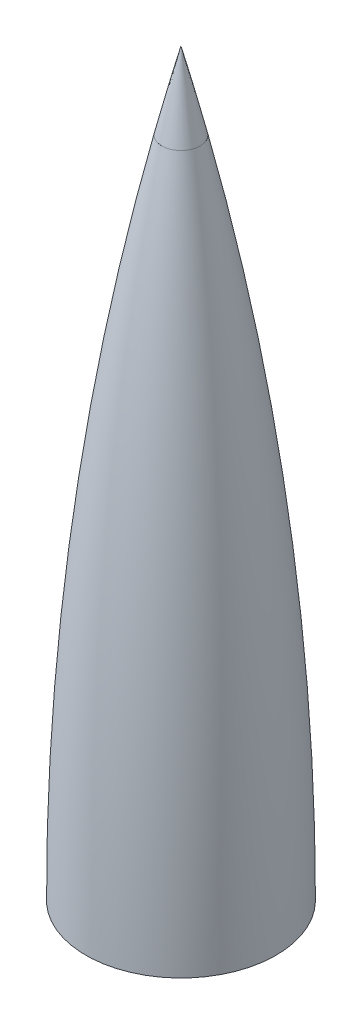
ISO-10303-21;
HEADER;
FILE_DESCRIPTION(('STEP AP214'),'2;1');
FILE_NAME('part.step','',(''),(''),'','','');
FILE_SCHEMA(('AUTOMOTIVE_DESIGN { 1 0 10303 214 1 1 1 1 }'));
ENDSEC;
DATA;
#1=APPLICATION_CONTEXT('core data for automotive mechanical design processes');
#2=APPLICATION_PROTOCOL_DEFINITION('international standard','automotive_design',2000,#1);
#3=PRODUCT_CONTEXT('',#1,'mechanical');
#4=PRODUCT('Part','Part','',(#3));
#5=PRODUCT_RELATED_PRODUCT_CATEGORY('part','',(#4));
#6=PRODUCT_DEFINITION_FORMATION('','',#4);
#7=PRODUCT_DEFINITION_CONTEXT('part definition',#1,'design');
#8=PRODUCT_DEFINITION('design','',#6,#7);
#9=PRODUCT_DEFINITION_SHAPE('','',#8);
#10=(LENGTH_UNIT() NAMED_UNIT(*) SI_UNIT(.MILLI.,.METRE.));
#11=(NAMED_UNIT(*) PLANE_ANGLE_UNIT() SI_UNIT($,.RADIAN.));
#12=(NAMED_UNIT(*) SI_UNIT($,.STERADIAN.) SOLID_ANGLE_UNIT());
#13=UNCERTAINTY_MEASURE_WITH_UNIT(LENGTH_MEASURE(1.E-05),#10,'distance_accuracy_value','');
#14=(GEOMETRIC_REPRESENTATION_CONTEXT(3) GLOBAL_UNCERTAINTY_ASSIGNED_CONTEXT((#13)) GLOBAL_UNIT_ASSIGNED_CONTEXT((#10,
#11,#12)) REPRESENTATION_CONTEXT('',''));
#15=CARTESIAN_POINT('',(0.,0.,0.));
#16=DIRECTION('',(0.,0.,1.));
#17=DIRECTION('',(1.,0.,0.));
#18=AXIS2_PLACEMENT_3D('',#15,#16,#17);
#19=CARTESIAN_POINT('',(0.,546.1,0.));
#20=DIRECTION('',(0.,1.,0.));
#21=DIRECTION('',(0.,0.,1.));
#22=AXIS2_PLACEMENT_3D('',#19,#20,#21);
#23=PLANE('',#22);
#24=CARTESIAN_POINT('',(0.,546.1,0.));
#25=DIRECTION('',(0.,1.,0.));
#26=DIRECTION('',(0.,0.,1.));
#27=AXIS2_PLACEMENT_3D('',#24,#25,#26);
#28=CIRCLE('',#27,15.6817968062124);
#29=CARTESIAN_POINT('',(0.,546.1,15.6817968062124));
#30=VERTEX_POINT('',#29);
#31=EDGE_CURVE('E12',#30,#30,#28,.T.);
#32=ORIENTED_EDGE('',*,*,#31,.F.);
#33=EDGE_LOOP('',(#32));
#34=FACE_BOUND('',#33,.T.);
#35=ADVANCED_FACE('F53',(#34),#23,.F.);
#36=CARTESIAN_POINT('',(0.,-0.00285855555803849,-2332.04763425161));
#37=DIRECTION('',(-1.,0.,0.));
#38=DIRECTION('',(0.,0.,1.));
#39=AXIS2_PLACEMENT_3D('',#36,#37,#38);
#40=CIRCLE('',#39,2410.40698090128);
#41=TRIMMED_CURVE('',#40,(PARAMETER_VALUE(-0.255681213942053)),
(PARAMETER_VALUE(0.255681213942053)),.T.,.PARAMETER.);
#42=CARTESIAN_POINT('',(0.,-0.00285855555803849,0.));
#43=DIRECTION('',(0.,1.,0.));
#44=AXIS1_PLACEMENT('',#42,#43);
#45=SURFACE_OF_REVOLUTION('',#41,#44);
#46=CARTESIAN_POINT('',(0.,609.6,0.));
#47=VERTEX_POINT('',#46);
#48=VERTEX_LOOP('',#47);
#49=FACE_BOUND('',#48,.T.);
#50=ORIENTED_EDGE('',*,*,#31,.T.);
#51=EDGE_LOOP('',(#50));
#52=FACE_BOUND('',#51,.T.);
#53=ADVANCED_FACE('F60',(#49,#52),#45,.T.);
#54=CLOSED_SHELL('',(#35,#53));
#55=MANIFOLD_SOLID_BREP('B2',#54);
#56=CARTESIAN_POINT('',(78.3589999999998,0.,0.));
#57=DIRECTION('',(0.,-1.,0.));
#58=DIRECTION('',(0.,0.,-1.));
#59=AXIS2_PLACEMENT_3D('',#56,#57,#58);
#60=PLANE('',#59);
#61=CARTESIAN_POINT('',(0.,0.,0.));
#62=DIRECTION('',(0.,-1.,0.));
#63=DIRECTION('',(0.,0.,-1.));
#64=AXIS2_PLACEMENT_3D('',#61,#62,#63);
#65=CIRCLE('',#64,76.1745999999999);
#66=CARTESIAN_POINT('',(0.,0.,-76.1745999999999));
#67=VERTEX_POINT('',#66);
#68=EDGE_CURVE('E91',#67,#67,#65,.T.);
#69=ORIENTED_EDGE('',*,*,#68,.F.);
#70=EDGE_LOOP('',(#69));
#71=FACE_BOUND('',#70,.T.);
#72=CARTESIAN_POINT('',(0.,0.,0.));
#73=DIRECTION('',(0.,-1.,0.));
#74=DIRECTION('',(0.,0.,-1.));
#75=AXIS2_PLACEMENT_3D('',#72,#73,#74);
#76=CIRCLE('',#75,78.3589999999998);
#77=CARTESIAN_POINT('',(0.,0.,-78.3589999999998));
#78=VERTEX_POINT('',#77);
#79=EDGE_CURVE('E52',#78,#78,#76,.T.);
#80=ORIENTED_EDGE('',*,*,#79,.T.);
#81=EDGE_LOOP('',(#80));
#82=FACE_BOUND('',#81,.T.);
#83=ADVANCED_FACE('F81',(#71,#82),#60,.T.);
#84=CARTESIAN_POINT('',(0.,0.,0.));
#85=DIRECTION('',(0.,-1.,0.));
#86=DIRECTION('',(0.,0.,-1.));
#87=AXIS2_PLACEMENT_3D('',#84,#85,#86);
#88=DEGENERATE_TOROIDAL_SURFACE('',#87,2332.03605915721,2410.39505915721,.F.);
#89=CARTESIAN_POINT('',(0.,546.1,0.));
#90=DIRECTION('',(0.,-1.,0.));
#91=DIRECTION('',(0.,0.,-1.));
#92=AXIS2_PLACEMENT_3D('',#89,#90,#91);
#93=CIRCLE('',#92,15.6817968062124);
#94=CARTESIAN_POINT('',(0.,546.1,-15.6817968062124));
#95=VERTEX_POINT('',#94);
#96=EDGE_CURVE('E87',#95,#95,#93,.T.);
#97=ORIENTED_EDGE('',*,*,#96,.T.);
#98=EDGE_LOOP('',(#97));
#99=FACE_BOUND('',#98,.T.);
#100=ORIENTED_EDGE('',*,*,#79,.F.);
#101=EDGE_LOOP('',(#100));
#102=FACE_BOUND('',#101,.T.);
#103=ADVANCED_FACE('F111',(#99,#102),#88,.F.);
#104=CARTESIAN_POINT('',(0.,546.1,0.));
#105=DIRECTION('',(0.,1.,0.));
#106=DIRECTION('',(0.,0.,1.));
#107=AXIS2_PLACEMENT_3D('',#104,#105,#106);
#108=PLANE('',#107);
#109=CARTESIAN_POINT('',(0.,546.1,0.));
#110=DIRECTION('',(0.,1.,0.));
#111=DIRECTION('',(0.,0.,1.));
#112=AXIS2_PLACEMENT_3D('',#109,#110,#111);
#113=CIRCLE('',#112,13.4390246751472);
#114=CARTESIAN_POINT('',(0.,546.1,13.4390246751472));
#115=VERTEX_POINT('',#114);
#116=EDGE_CURVE('E95',#115,#115,#113,.F.);
#117=ORIENTED_EDGE('',*,*,#116,.T.);
#118=EDGE_LOOP('',(#117));
#119=FACE_BOUND('',#118,.T.);
#120=ORIENTED_EDGE('',*,*,#96,.F.);
#121=EDGE_LOOP('',(#120));
#122=FACE_BOUND('',#121,.T.);
#123=ADVANCED_FACE('F101',(#119,#122),#108,.T.);
#124=CARTESIAN_POINT('',(0.,0.,0.));
#125=DIRECTION('',(0.,-1.,0.));
#126=DIRECTION('',(0.,0.,-1.));
#127=AXIS2_PLACEMENT_3D('',#124,#125,#126);
#128=DEGENERATE_TOROIDAL_SURFACE('',#127,2332.03605915721,2408.21065915721,.F.);
#129=ORIENTED_EDGE('',*,*,#116,.F.);
#130=EDGE_LOOP('',(#129));
#131=FACE_BOUND('',#130,.T.);
#132=ORIENTED_EDGE('',*,*,#68,.T.);
#133=EDGE_LOOP('',(#132));
#134=FACE_BOUND('',#133,.T.);
#135=ADVANCED_FACE('F104',(#131,#134),#128,.T.);
#136=CLOSED_SHELL('',(#83,#103,#123,#135));
#137=MANIFOLD_SOLID_BREP('B6',#136);
#138=ADVANCED_BREP_SHAPE_REPRESENTATION('',(#18,#55,#137),#14);
#139=SHAPE_DEFINITION_REPRESENTATION(#9,#138);
ENDSEC;
END-ISO-10303-21;
